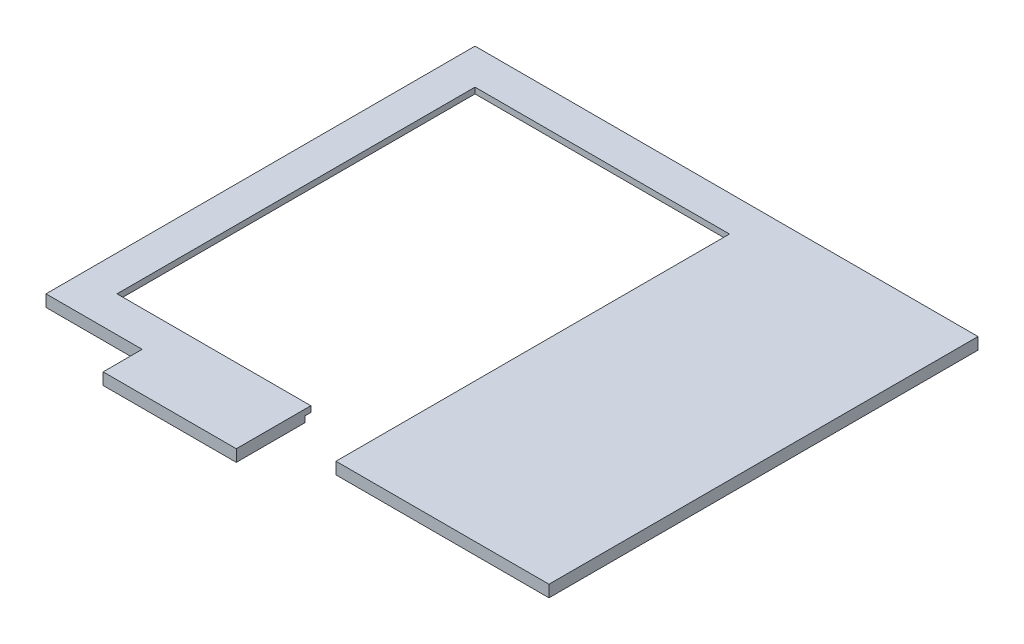
ISO-10303-21;
HEADER;
FILE_DESCRIPTION(('STEP AP214'),'2;1');
FILE_NAME('part.step','',(''),(''),'','','');
FILE_SCHEMA(('AUTOMOTIVE_DESIGN { 1 0 10303 214 1 1 1 1 }'));
ENDSEC;
DATA;
#1=APPLICATION_CONTEXT('core data for automotive mechanical design processes');
#2=APPLICATION_PROTOCOL_DEFINITION('international standard','automotive_design',2000,#1);
#3=PRODUCT_CONTEXT('',#1,'mechanical');
#4=PRODUCT('Part','Part','',(#3));
#5=PRODUCT_RELATED_PRODUCT_CATEGORY('part','',(#4));
#6=PRODUCT_DEFINITION_FORMATION('','',#4);
#7=PRODUCT_DEFINITION_CONTEXT('part definition',#1,'design');
#8=PRODUCT_DEFINITION('design','',#6,#7);
#9=PRODUCT_DEFINITION_SHAPE('','',#8);
#10=(LENGTH_UNIT() NAMED_UNIT(*) SI_UNIT(.MILLI.,.METRE.));
#11=(NAMED_UNIT(*) PLANE_ANGLE_UNIT() SI_UNIT($,.RADIAN.));
#12=(NAMED_UNIT(*) SI_UNIT($,.STERADIAN.) SOLID_ANGLE_UNIT());
#13=UNCERTAINTY_MEASURE_WITH_UNIT(LENGTH_MEASURE(1.E-05),#10,'distance_accuracy_value','');
#14=(GEOMETRIC_REPRESENTATION_CONTEXT(3) GLOBAL_UNCERTAINTY_ASSIGNED_CONTEXT((#13)) GLOBAL_UNIT_ASSIGNED_CONTEXT((#10,
#11,#12)) REPRESENTATION_CONTEXT('',''));
#15=CARTESIAN_POINT('',(0.,0.,0.));
#16=DIRECTION('',(0.,0.,1.));
#17=DIRECTION('',(1.,0.,0.));
#18=AXIS2_PLACEMENT_3D('',#15,#16,#17);
#19=CARTESIAN_POINT('',(0.,59.3432263892751,215.861584775313));
#20=DIRECTION('',(0.,0.,-1.));
#21=DIRECTION('',(-1.,0.,0.));
#22=AXIS2_PLACEMENT_3D('',#19,#20,#21);
#23=PLANE('',#22);
#24=DIRECTION('',(0.,1.,0.));
#25=VECTOR('',#24,1.);
#26=CARTESIAN_POINT('',(-39.181843772894,49.3432263892751,215.861584775313));
#27=LINE('',#26,#25);
#28=CARTESIAN_POINT('',(-39.181843772894,55.3432263892751,215.861584775313));
#29=VERTEX_POINT('',#28);
#30=CARTESIAN_POINT('',(-39.181843772894,59.3432263892751,215.861584775313));
#31=VERTEX_POINT('',#30);
#32=EDGE_CURVE('E185',#29,#31,#27,.T.);
#33=ORIENTED_EDGE('',*,*,#32,.F.);
#34=DIRECTION('',(1.,0.,0.));
#35=VECTOR('',#34,1.);
#36=CARTESIAN_POINT('',(0.,55.3432263892751,215.861584775313));
#37=LINE('',#36,#35);
#38=CARTESIAN_POINT('',(32.818156227106,55.3432263892751,215.861584775313));
#39=VERTEX_POINT('',#38);
#40=EDGE_CURVE('E246',#29,#39,#37,.T.);
#41=ORIENTED_EDGE('',*,*,#40,.T.);
#42=DIRECTION('',(0.,-1.,0.));
#43=VECTOR('',#42,1.);
#44=CARTESIAN_POINT('',(32.818156227106,59.3432263892751,215.861584775313));
#45=LINE('',#44,#43);
#46=CARTESIAN_POINT('',(32.818156227106,59.3432263892751,215.861584775313));
#47=VERTEX_POINT('',#46);
#48=EDGE_CURVE('E195',#47,#39,#45,.T.);
#49=ORIENTED_EDGE('',*,*,#48,.F.);
#50=DIRECTION('',(1.,0.,0.));
#51=VECTOR('',#50,1.);
#52=CARTESIAN_POINT('',(0.,59.3432263892751,215.861584775313));
#53=LINE('',#52,#51);
#54=EDGE_CURVE('E175',#31,#47,#53,.T.);
#55=ORIENTED_EDGE('',*,*,#54,.F.);
#56=EDGE_LOOP('',(#33,#41,#49,#55));
#57=FACE_BOUND('',#56,.T.);
#58=ADVANCED_FACE('F46',(#57),#23,.F.);
#59=CARTESIAN_POINT('',(0.,59.3432263892751,205.861584775313));
#60=DIRECTION('',(0.,0.,1.));
#61=DIRECTION('',(1.,0.,0.));
#62=AXIS2_PLACEMENT_3D('',#59,#60,#61);
#63=PLANE('',#62);
#64=DIRECTION('',(0.,-1.,0.));
#65=VECTOR('',#64,1.);
#66=CARTESIAN_POINT('',(-39.181843772894,59.3432263892751,205.861584775313));
#67=LINE('',#66,#65);
#68=CARTESIAN_POINT('',(-39.181843772894,57.3432263892751,205.861584775313));
#69=VERTEX_POINT('',#68);
#70=CARTESIAN_POINT('',(-39.181843772894,55.3432263892751,205.861584775313));
#71=VERTEX_POINT('',#70);
#72=EDGE_CURVE('E369',#69,#71,#67,.T.);
#73=ORIENTED_EDGE('',*,*,#72,.F.);
#74=DIRECTION('',(1.,0.,0.));
#75=VECTOR('',#74,1.);
#76=CARTESIAN_POINT('',(-37.181843772894,57.3432263892751,205.861584775313));
#77=LINE('',#76,#75);
#78=CARTESIAN_POINT('',(-37.181843772894,57.3432263892751,205.861584775313));
#79=VERTEX_POINT('',#78);
#80=EDGE_CURVE('E356',#69,#79,#77,.T.);
#81=ORIENTED_EDGE('',*,*,#80,.T.);
#82=DIRECTION('',(0.,-1.,0.));
#83=VECTOR('',#82,1.);
#84=CARTESIAN_POINT('',(-37.181843772894,59.3432263892751,205.861584775313));
#85=LINE('',#84,#83);
#86=CARTESIAN_POINT('',(-37.181843772894,55.3432263892751,205.861584775313));
#87=VERTEX_POINT('',#86);
#88=EDGE_CURVE('E294',#79,#87,#85,.T.);
#89=ORIENTED_EDGE('',*,*,#88,.T.);
#90=DIRECTION('',(-1.,0.,0.));
#91=VECTOR('',#90,1.);
#92=CARTESIAN_POINT('',(0.,55.3432263892751,205.861584775313));
#93=LINE('',#92,#91);
#94=EDGE_CURVE('E228',#87,#71,#93,.T.);
#95=ORIENTED_EDGE('',*,*,#94,.T.);
#96=EDGE_LOOP('',(#73,#81,#89,#95));
#97=FACE_BOUND('',#96,.T.);
#98=ADVANCED_FACE('F404',(#97),#63,.F.);
#99=CARTESIAN_POINT('',(-104.681843772894,59.3432263892751,0.));
#100=DIRECTION('',(1.,0.,0.));
#101=DIRECTION('',(0.,0.,-1.));
#102=AXIS2_PLACEMENT_3D('',#99,#100,#101);
#103=PLANE('',#102);
#104=DIRECTION('',(0.,0.,1.));
#105=VECTOR('',#104,1.);
#106=CARTESIAN_POINT('',(-104.681843772894,55.3432263892751,0.));
#107=LINE('',#106,#105);
#108=CARTESIAN_POINT('',(-104.681843772894,55.3432263892751,215.861584775313));
#109=VERTEX_POINT('',#108);
#110=CARTESIAN_POINT('',(-104.681843772894,55.3432263892751,229.045240407346));
#111=VERTEX_POINT('',#110);
#112=EDGE_CURVE('E236',#109,#111,#107,.T.);
#113=ORIENTED_EDGE('',*,*,#112,.T.);
#114=DIRECTION('',(0.,-1.,0.));
#115=VECTOR('',#114,1.);
#116=CARTESIAN_POINT('',(-104.681843772894,59.3432263892751,229.045240407346));
#117=LINE('',#116,#115);
#118=CARTESIAN_POINT('',(-104.681843772894,59.3432263892751,229.045240407346));
#119=VERTEX_POINT('',#118);
#120=EDGE_CURVE('E55',#119,#111,#117,.T.);
#121=ORIENTED_EDGE('',*,*,#120,.F.);
#122=DIRECTION('',(0.,0.,1.));
#123=VECTOR('',#122,1.);
#124=CARTESIAN_POINT('',(-104.681843772894,59.3432263892751,0.));
#125=LINE('',#124,#123);
#126=CARTESIAN_POINT('',(-104.681843772894,59.3432263892751,215.861584775313));
#127=VERTEX_POINT('',#126);
#128=EDGE_CURVE('E261',#127,#119,#125,.T.);
#129=ORIENTED_EDGE('',*,*,#128,.F.);
#130=DIRECTION('',(0.,-1.,0.));
#131=VECTOR('',#130,1.);
#132=CARTESIAN_POINT('',(-104.681843772894,59.3432263892751,215.861584775313));
#133=LINE('',#132,#131);
#134=EDGE_CURVE('E262',#127,#109,#133,.T.);
#135=ORIENTED_EDGE('',*,*,#134,.T.);
#136=EDGE_LOOP('',(#113,#121,#129,#135));
#137=FACE_BOUND('',#136,.T.);
#138=ADVANCED_FACE('F400',(#137),#103,.F.);
#139=CARTESIAN_POINT('',(0.,59.3432263892751,229.045240407346));
#140=DIRECTION('',(0.,0.,-1.));
#141=DIRECTION('',(-1.,0.,0.));
#142=AXIS2_PLACEMENT_3D('',#139,#140,#141);
#143=PLANE('',#142);
#144=DIRECTION('',(1.,0.,0.));
#145=VECTOR('',#144,1.);
#146=CARTESIAN_POINT('',(0.,55.3432263892751,229.045240407346));
#147=LINE('',#146,#145);
#148=CARTESIAN_POINT('',(-59.681843772894,55.3432263892751,229.045240407346));
#149=VERTEX_POINT('',#148);
#150=EDGE_CURVE('E240',#111,#149,#147,.T.);
#151=ORIENTED_EDGE('',*,*,#150,.T.);
#152=DIRECTION('',(0.,-1.,0.));
#153=VECTOR('',#152,1.);
#154=CARTESIAN_POINT('',(-59.681843772894,59.3432263892751,229.045240407346));
#155=LINE('',#154,#153);
#156=CARTESIAN_POINT('',(-59.681843772894,59.3432263892751,229.045240407346));
#157=VERTEX_POINT('',#156);
#158=EDGE_CURVE('E281',#157,#149,#155,.T.);
#159=ORIENTED_EDGE('',*,*,#158,.F.);
#160=DIRECTION('',(1.,0.,0.));
#161=VECTOR('',#160,1.);
#162=CARTESIAN_POINT('',(0.,59.3432263892751,229.045240407346));
#163=LINE('',#162,#161);
#164=EDGE_CURVE('E205',#119,#157,#163,.T.);
#165=ORIENTED_EDGE('',*,*,#164,.F.);
#166=ORIENTED_EDGE('',*,*,#120,.T.);
#167=EDGE_LOOP('',(#151,#159,#165,#166));
#168=FACE_BOUND('',#167,.T.);
#169=ADVANCED_FACE('F386',(#168),#143,.F.);
#170=CARTESIAN_POINT('',(-59.681843772894,59.3432263892751,0.));
#171=DIRECTION('',(-1.,0.,0.));
#172=DIRECTION('',(0.,0.,1.));
#173=AXIS2_PLACEMENT_3D('',#170,#171,#172);
#174=PLANE('',#173);
#175=DIRECTION('',(0.,0.,-1.));
#176=VECTOR('',#175,1.);
#177=CARTESIAN_POINT('',(-59.681843772894,55.3432263892751,0.));
#178=LINE('',#177,#176);
#179=CARTESIAN_POINT('',(-59.681843772894,55.3432263892751,205.861584775313));
#180=VERTEX_POINT('',#179);
#181=EDGE_CURVE('E243',#149,#180,#178,.T.);
#182=ORIENTED_EDGE('',*,*,#181,.T.);
#183=DIRECTION('',(0.,-1.,0.));
#184=VECTOR('',#183,1.);
#185=CARTESIAN_POINT('',(-59.681843772894,59.3432263892751,205.861584775313));
#186=LINE('',#185,#184);
#187=CARTESIAN_POINT('',(-59.681843772894,57.3432263892751,205.861584775313));
#188=VERTEX_POINT('',#187);
#189=EDGE_CURVE('E61',#188,#180,#186,.T.);
#190=ORIENTED_EDGE('',*,*,#189,.F.);
#191=DIRECTION('',(0.,0.,-1.));
#192=VECTOR('',#191,1.);
#193=CARTESIAN_POINT('',(-59.681843772894,57.3432263892751,205.861584775313));
#194=LINE('',#193,#192);
#195=CARTESIAN_POINT('',(-59.681843772894,57.3432263892751,203.861584775313));
#196=VERTEX_POINT('',#195);
#197=EDGE_CURVE('E11',#188,#196,#194,.T.);
#198=ORIENTED_EDGE('',*,*,#197,.T.);
#199=DIRECTION('',(0.,1.,0.));
#200=VECTOR('',#199,1.);
#201=CARTESIAN_POINT('',(-59.681843772894,49.3432263892751,203.861584775313));
#202=LINE('',#201,#200);
#203=CARTESIAN_POINT('',(-59.681843772894,59.3432263892751,203.861584775313));
#204=VERTEX_POINT('',#203);
#205=EDGE_CURVE('E192',#196,#204,#202,.T.);
#206=ORIENTED_EDGE('',*,*,#205,.T.);
#207=DIRECTION('',(0.,0.,-1.));
#208=VECTOR('',#207,1.);
#209=CARTESIAN_POINT('',(-59.681843772894,59.3432263892751,0.));
#210=LINE('',#209,#208);
#211=EDGE_CURVE('E199',#157,#204,#210,.T.);
#212=ORIENTED_EDGE('',*,*,#211,.F.);
#213=ORIENTED_EDGE('',*,*,#158,.T.);
#214=EDGE_LOOP('',(#182,#190,#198,#206,#212,#213));
#215=FACE_BOUND('',#214,.T.);
#216=ADVANCED_FACE('F387',(#215),#174,.F.);
#217=CARTESIAN_POINT('',(32.818156227106,59.3432263892751,0.));
#218=DIRECTION('',(-1.,0.,0.));
#219=DIRECTION('',(0.,0.,1.));
#220=AXIS2_PLACEMENT_3D('',#217,#218,#219);
#221=PLANE('',#220);
#222=DIRECTION('',(0.,0.,-1.));
#223=VECTOR('',#222,1.);
#224=CARTESIAN_POINT('',(32.818156227106,55.3432263892751,0.));
#225=LINE('',#224,#223);
#226=CARTESIAN_POINT('',(32.818156227106,55.3432263892751,70.8615847753127));
#227=VERTEX_POINT('',#226);
#228=EDGE_CURVE('E249',#39,#227,#225,.T.);
#229=ORIENTED_EDGE('',*,*,#228,.T.);
#230=DIRECTION('',(0.,-1.,0.));
#231=VECTOR('',#230,1.);
#232=CARTESIAN_POINT('',(32.818156227106,59.3432263892751,70.8615847753127));
#233=LINE('',#232,#231);
#234=CARTESIAN_POINT('',(32.818156227106,59.3432263892751,70.8615847753127));
#235=VERTEX_POINT('',#234);
#236=EDGE_CURVE('E275',#235,#227,#233,.T.);
#237=ORIENTED_EDGE('',*,*,#236,.F.);
#238=DIRECTION('',(0.,0.,-1.));
#239=VECTOR('',#238,1.);
#240=CARTESIAN_POINT('',(32.818156227106,59.3432263892751,0.));
#241=LINE('',#240,#239);
#242=EDGE_CURVE('E198',#47,#235,#241,.T.);
#243=ORIENTED_EDGE('',*,*,#242,.F.);
#244=ORIENTED_EDGE('',*,*,#48,.T.);
#245=EDGE_LOOP('',(#229,#237,#243,#244));
#246=FACE_BOUND('',#245,.T.);
#247=ADVANCED_FACE('F389',(#246),#221,.F.);
#248=CARTESIAN_POINT('',(0.,59.3432263892751,70.8615847753127));
#249=DIRECTION('',(0.,0.,1.));
#250=DIRECTION('',(1.,0.,0.));
#251=AXIS2_PLACEMENT_3D('',#248,#249,#250);
#252=PLANE('',#251);
#253=DIRECTION('',(-1.,0.,0.));
#254=VECTOR('',#253,1.);
#255=CARTESIAN_POINT('',(0.,55.3432263892751,70.8615847753127));
#256=LINE('',#255,#254);
#257=CARTESIAN_POINT('',(-137.181843772894,55.3432263892751,70.8615847753127));
#258=VERTEX_POINT('',#257);
#259=EDGE_CURVE('E252',#227,#258,#256,.T.);
#260=ORIENTED_EDGE('',*,*,#259,.T.);
#261=DIRECTION('',(0.,-1.,0.));
#262=VECTOR('',#261,1.);
#263=CARTESIAN_POINT('',(-137.181843772894,59.3432263892751,70.8615847753127));
#264=LINE('',#263,#262);
#265=CARTESIAN_POINT('',(-137.181843772894,59.3432263892751,70.8615847753127));
#266=VERTEX_POINT('',#265);
#267=EDGE_CURVE('E271',#266,#258,#264,.T.);
#268=ORIENTED_EDGE('',*,*,#267,.F.);
#269=DIRECTION('',(-1.,0.,0.));
#270=VECTOR('',#269,1.);
#271=CARTESIAN_POINT('',(0.,59.3432263892751,70.8615847753127));
#272=LINE('',#271,#270);
#273=EDGE_CURVE('E203',#235,#266,#272,.T.);
#274=ORIENTED_EDGE('',*,*,#273,.F.);
#275=ORIENTED_EDGE('',*,*,#236,.T.);
#276=EDGE_LOOP('',(#260,#268,#274,#275));
#277=FACE_BOUND('',#276,.T.);
#278=ADVANCED_FACE('F396',(#277),#252,.F.);
#279=CARTESIAN_POINT('',(-137.181843772894,59.3432263892751,0.));
#280=DIRECTION('',(1.,0.,0.));
#281=DIRECTION('',(0.,0.,-1.));
#282=AXIS2_PLACEMENT_3D('',#279,#280,#281);
#283=PLANE('',#282);
#284=DIRECTION('',(0.,0.,1.));
#285=VECTOR('',#284,1.);
#286=CARTESIAN_POINT('',(-137.181843772894,55.3432263892751,0.));
#287=LINE('',#286,#285);
#288=CARTESIAN_POINT('',(-137.181843772894,55.3432263892751,215.861584775313));
#289=VERTEX_POINT('',#288);
#290=EDGE_CURVE('E255',#258,#289,#287,.T.);
#291=ORIENTED_EDGE('',*,*,#290,.T.);
#292=DIRECTION('',(0.,-1.,0.));
#293=VECTOR('',#292,1.);
#294=CARTESIAN_POINT('',(-137.181843772894,59.3432263892751,215.861584775313));
#295=LINE('',#294,#293);
#296=CARTESIAN_POINT('',(-137.181843772894,59.3432263892751,215.861584775313));
#297=VERTEX_POINT('',#296);
#298=EDGE_CURVE('E266',#297,#289,#295,.T.);
#299=ORIENTED_EDGE('',*,*,#298,.F.);
#300=DIRECTION('',(0.,0.,1.));
#301=VECTOR('',#300,1.);
#302=CARTESIAN_POINT('',(-137.181843772894,59.3432263892751,0.));
#303=LINE('',#302,#301);
#304=EDGE_CURVE('E211',#266,#297,#303,.T.);
#305=ORIENTED_EDGE('',*,*,#304,.F.);
#306=ORIENTED_EDGE('',*,*,#267,.T.);
#307=EDGE_LOOP('',(#291,#299,#305,#306));
#308=FACE_BOUND('',#307,.T.);
#309=ADVANCED_FACE('F415',(#308),#283,.F.);
#310=CARTESIAN_POINT('',(0.,59.3432263892751,80.8615847753127));
#311=DIRECTION('',(0.,0.,-1.));
#312=DIRECTION('',(-1.,0.,0.));
#313=AXIS2_PLACEMENT_3D('',#310,#311,#312);
#314=PLANE('',#313);
#315=DIRECTION('',(0.,-1.,0.));
#316=VECTOR('',#315,1.);
#317=CARTESIAN_POINT('',(-37.181843772894,59.3432263892751,80.8615847753127));
#318=LINE('',#317,#316);
#319=CARTESIAN_POINT('',(-37.181843772894,57.3432263892751,80.8615847753127));
#320=VERTEX_POINT('',#319);
#321=CARTESIAN_POINT('',(-37.181843772894,55.3432263892751,80.8615847753127));
#322=VERTEX_POINT('',#321);
#323=EDGE_CURVE('E267',#320,#322,#318,.T.);
#324=ORIENTED_EDGE('',*,*,#323,.F.);
#325=DIRECTION('',(-1.,0.,0.));
#326=VECTOR('',#325,1.);
#327=CARTESIAN_POINT('',(-127.181843772894,57.3432263892751,80.8615847753127));
#328=LINE('',#327,#326);
#329=CARTESIAN_POINT('',(-127.181843772894,57.3432263892751,80.8615847753127));
#330=VERTEX_POINT('',#329);
#331=EDGE_CURVE('E314',#320,#330,#328,.T.);
#332=ORIENTED_EDGE('',*,*,#331,.T.);
#333=DIRECTION('',(0.,-1.,0.));
#334=VECTOR('',#333,1.);
#335=CARTESIAN_POINT('',(-127.181843772894,59.3432263892751,80.8615847753127));
#336=LINE('',#335,#334);
#337=CARTESIAN_POINT('',(-127.181843772894,55.3432263892751,80.8615847753127));
#338=VERTEX_POINT('',#337);
#339=EDGE_CURVE('E217',#330,#338,#336,.T.);
#340=ORIENTED_EDGE('',*,*,#339,.T.);
#341=DIRECTION('',(1.,0.,0.));
#342=VECTOR('',#341,1.);
#343=CARTESIAN_POINT('',(0.,55.3432263892751,80.8615847753127));
#344=LINE('',#343,#342);
#345=EDGE_CURVE('E218',#338,#322,#344,.T.);
#346=ORIENTED_EDGE('',*,*,#345,.T.);
#347=EDGE_LOOP('',(#324,#332,#340,#346));
#348=FACE_BOUND('',#347,.T.);
#349=ADVANCED_FACE('F48',(#348),#314,.F.);
#350=CARTESIAN_POINT('',(-37.181843772894,59.3432263892751,0.));
#351=DIRECTION('',(1.,0.,0.));
#352=DIRECTION('',(0.,0.,-1.));
#353=AXIS2_PLACEMENT_3D('',#350,#351,#352);
#354=PLANE('',#353);
#355=ORIENTED_EDGE('',*,*,#88,.F.);
#356=DIRECTION('',(0.,0.,-1.));
#357=VECTOR('',#356,1.);
#358=CARTESIAN_POINT('',(-37.181843772894,57.3432263892751,80.8615847753127));
#359=LINE('',#358,#357);
#360=EDGE_CURVE('E305',#79,#320,#359,.T.);
#361=ORIENTED_EDGE('',*,*,#360,.T.);
#362=ORIENTED_EDGE('',*,*,#323,.T.);
#363=DIRECTION('',(0.,0.,1.));
#364=VECTOR('',#363,1.);
#365=CARTESIAN_POINT('',(-37.181843772894,55.3432263892751,0.));
#366=LINE('',#365,#364);
#367=EDGE_CURVE('E222',#322,#87,#366,.T.);
#368=ORIENTED_EDGE('',*,*,#367,.T.);
#369=EDGE_LOOP('',(#355,#361,#362,#368));
#370=FACE_BOUND('',#369,.T.);
#371=ADVANCED_FACE('F302',(#370),#354,.F.);
#372=CARTESIAN_POINT('',(-127.181843772894,57.3432263892751,205.861584775313));
#373=VERTEX_POINT('',#372);
#374=EDGE_CURVE('E68',#373,#188,#77,.T.);
#375=ORIENTED_EDGE('',*,*,#374,.T.);
#376=ORIENTED_EDGE('',*,*,#189,.T.);
#377=CARTESIAN_POINT('',(-127.181843772894,55.3432263892751,205.861584775313));
#378=VERTEX_POINT('',#377);
#379=EDGE_CURVE('E227',#180,#378,#93,.T.);
#380=ORIENTED_EDGE('',*,*,#379,.T.);
#381=DIRECTION('',(0.,-1.,0.));
#382=VECTOR('',#381,1.);
#383=CARTESIAN_POINT('',(-127.181843772894,59.3432263892751,205.861584775313));
#384=LINE('',#383,#382);
#385=EDGE_CURVE('E290',#373,#378,#384,.T.);
#386=ORIENTED_EDGE('',*,*,#385,.F.);
#387=EDGE_LOOP('',(#375,#376,#380,#386));
#388=FACE_BOUND('',#387,.T.);
#389=ADVANCED_FACE('F411',(#388),#63,.F.);
#390=CARTESIAN_POINT('',(-127.181843772894,59.3432263892751,0.));
#391=DIRECTION('',(-1.,0.,0.));
#392=DIRECTION('',(0.,0.,1.));
#393=AXIS2_PLACEMENT_3D('',#390,#391,#392);
#394=PLANE('',#393);
#395=ORIENTED_EDGE('',*,*,#339,.F.);
#396=DIRECTION('',(0.,0.,1.));
#397=VECTOR('',#396,1.);
#398=CARTESIAN_POINT('',(-127.181843772894,57.3432263892751,205.861584775313));
#399=LINE('',#398,#397);
#400=EDGE_CURVE('E362',#330,#373,#399,.T.);
#401=ORIENTED_EDGE('',*,*,#400,.T.);
#402=ORIENTED_EDGE('',*,*,#385,.T.);
#403=DIRECTION('',(0.,0.,-1.));
#404=VECTOR('',#403,1.);
#405=CARTESIAN_POINT('',(-127.181843772894,55.3432263892751,0.));
#406=LINE('',#405,#404);
#407=EDGE_CURVE('E232',#378,#338,#406,.T.);
#408=ORIENTED_EDGE('',*,*,#407,.T.);
#409=EDGE_LOOP('',(#395,#401,#402,#408));
#410=FACE_BOUND('',#409,.T.);
#411=ADVANCED_FACE('F316',(#410),#394,.F.);
#412=CARTESIAN_POINT('',(0.,59.3432263892751,215.861584775313));
#413=DIRECTION('',(0.,0.,-1.));
#414=DIRECTION('',(-1.,0.,0.));
#415=AXIS2_PLACEMENT_3D('',#412,#413,#414);
#416=PLANE('',#415);
#417=DIRECTION('',(1.,0.,0.));
#418=VECTOR('',#417,1.);
#419=CARTESIAN_POINT('',(0.,55.3432263892751,215.861584775313));
#420=LINE('',#419,#418);
#421=EDGE_CURVE('E258',#289,#109,#420,.T.);
#422=ORIENTED_EDGE('',*,*,#421,.T.);
#423=ORIENTED_EDGE('',*,*,#134,.F.);
#424=DIRECTION('',(1.,0.,0.));
#425=VECTOR('',#424,1.);
#426=CARTESIAN_POINT('',(0.,59.3432263892751,215.861584775313));
#427=LINE('',#426,#425);
#428=EDGE_CURVE('E214',#297,#127,#427,.T.);
#429=ORIENTED_EDGE('',*,*,#428,.F.);
#430=ORIENTED_EDGE('',*,*,#298,.T.);
#431=EDGE_LOOP('',(#422,#423,#429,#430));
#432=FACE_BOUND('',#431,.T.);
#433=ADVANCED_FACE('F420',(#432),#416,.F.);
#434=CARTESIAN_POINT('',(0.,59.3432263892751,0.));
#435=DIRECTION('',(0.,1.,0.));
#436=DIRECTION('',(0.,0.,1.));
#437=AXIS2_PLACEMENT_3D('',#434,#435,#436);
#438=PLANE('',#437);
#439=ORIENTED_EDGE('',*,*,#211,.T.);
#440=DIRECTION('',(1.,0.,0.));
#441=VECTOR('',#440,1.);
#442=CARTESIAN_POINT('',(-39.181843772894,59.3432263892751,203.861584775313));
#443=LINE('',#442,#441);
#444=CARTESIAN_POINT('',(-125.181843772894,59.3432263892751,203.861584775313));
#445=VERTEX_POINT('',#444);
#446=EDGE_CURVE('E347',#445,#204,#443,.T.);
#447=ORIENTED_EDGE('',*,*,#446,.F.);
#448=DIRECTION('',(0.,0.,1.));
#449=VECTOR('',#448,1.);
#450=CARTESIAN_POINT('',(-125.181843772894,59.3432263892751,203.861584775313));
#451=LINE('',#450,#449);
#452=CARTESIAN_POINT('',(-125.181843772894,59.3432263892751,82.8615847753127));
#453=VERTEX_POINT('',#452);
#454=EDGE_CURVE('E340',#453,#445,#451,.T.);
#455=ORIENTED_EDGE('',*,*,#454,.F.);
#456=DIRECTION('',(-1.,0.,0.));
#457=VECTOR('',#456,1.);
#458=CARTESIAN_POINT('',(-125.181843772894,59.3432263892751,82.8615847753127));
#459=LINE('',#458,#457);
#460=CARTESIAN_POINT('',(-39.181843772894,59.3432263892751,82.8615847753127));
#461=VERTEX_POINT('',#460);
#462=EDGE_CURVE('E179',#461,#453,#459,.T.);
#463=ORIENTED_EDGE('',*,*,#462,.F.);
#464=DIRECTION('',(0.,0.,-1.));
#465=VECTOR('',#464,1.);
#466=CARTESIAN_POINT('',(-39.181843772894,59.3432263892751,82.8615847753127));
#467=LINE('',#466,#465);
#468=EDGE_CURVE('E171',#31,#461,#467,.T.);
#469=ORIENTED_EDGE('',*,*,#468,.F.);
#470=ORIENTED_EDGE('',*,*,#54,.T.);
#471=ORIENTED_EDGE('',*,*,#242,.T.);
#472=ORIENTED_EDGE('',*,*,#273,.T.);
#473=ORIENTED_EDGE('',*,*,#304,.T.);
#474=ORIENTED_EDGE('',*,*,#428,.T.);
#475=ORIENTED_EDGE('',*,*,#128,.T.);
#476=ORIENTED_EDGE('',*,*,#164,.T.);
#477=EDGE_LOOP('',(#439,#447,#455,#463,#469,#470,#471,#472,#473,#474,#475,#476));
#478=FACE_BOUND('',#477,.T.);
#479=ADVANCED_FACE('F173',(#478),#438,.T.);
#480=CARTESIAN_POINT('',(0.,55.3432263892751,0.));
#481=DIRECTION('',(0.,1.,0.));
#482=DIRECTION('',(0.,0.,1.));
#483=AXIS2_PLACEMENT_3D('',#480,#481,#482);
#484=PLANE('',#483);
#485=ORIENTED_EDGE('',*,*,#379,.F.);
#486=ORIENTED_EDGE('',*,*,#181,.F.);
#487=ORIENTED_EDGE('',*,*,#150,.F.);
#488=ORIENTED_EDGE('',*,*,#112,.F.);
#489=ORIENTED_EDGE('',*,*,#421,.F.);
#490=ORIENTED_EDGE('',*,*,#290,.F.);
#491=ORIENTED_EDGE('',*,*,#259,.F.);
#492=ORIENTED_EDGE('',*,*,#228,.F.);
#493=ORIENTED_EDGE('',*,*,#40,.F.);
#494=DIRECTION('',(0.,0.,1.));
#495=VECTOR('',#494,1.);
#496=CARTESIAN_POINT('',(-39.181843772894,55.3432263892751,0.));
#497=LINE('',#496,#495);
#498=EDGE_CURVE('E188',#71,#29,#497,.T.);
#499=ORIENTED_EDGE('',*,*,#498,.F.);
#500=ORIENTED_EDGE('',*,*,#94,.F.);
#501=ORIENTED_EDGE('',*,*,#367,.F.);
#502=ORIENTED_EDGE('',*,*,#345,.F.);
#503=ORIENTED_EDGE('',*,*,#407,.F.);
#504=EDGE_LOOP('',(#485,#486,#487,#488,#489,#490,#491,#492,#493,#499,#500,#501,#502,#503));
#505=FACE_BOUND('',#504,.T.);
#506=ADVANCED_FACE('F311',(#505),#484,.F.);
#507=CARTESIAN_POINT('',(-39.181843772894,-96.6859916182185,203.861584775313));
#508=DIRECTION('',(0.,0.,1.));
#509=DIRECTION('',(1.,0.,0.));
#510=AXIS2_PLACEMENT_3D('',#507,#508,#509);
#511=PLANE('',#510);
#512=ORIENTED_EDGE('',*,*,#446,.T.);
#513=ORIENTED_EDGE('',*,*,#205,.F.);
#514=DIRECTION('',(1.,0.,0.));
#515=VECTOR('',#514,1.);
#516=CARTESIAN_POINT('',(-39.181843772894,57.3432263892751,203.861584775313));
#517=LINE('',#516,#515);
#518=CARTESIAN_POINT('',(-125.181843772894,57.3432263892751,203.861584775313));
#519=VERTEX_POINT('',#518);
#520=EDGE_CURVE('E328',#519,#196,#517,.T.);
#521=ORIENTED_EDGE('',*,*,#520,.F.);
#522=DIRECTION('',(0.,1.,0.));
#523=VECTOR('',#522,1.);
#524=CARTESIAN_POINT('',(-125.181843772894,-96.6859916182185,203.861584775313));
#525=LINE('',#524,#523);
#526=EDGE_CURVE('E351',#519,#445,#525,.T.);
#527=ORIENTED_EDGE('',*,*,#526,.T.);
#528=EDGE_LOOP('',(#512,#513,#521,#527));
#529=FACE_BOUND('',#528,.T.);
#530=ADVANCED_FACE('F426',(#529),#511,.F.);
#531=CARTESIAN_POINT('',(-125.181843772894,-96.6859916182185,203.861584775313));
#532=DIRECTION('',(-1.,0.,0.));
#533=DIRECTION('',(0.,0.,1.));
#534=AXIS2_PLACEMENT_3D('',#531,#532,#533);
#535=PLANE('',#534);
#536=DIRECTION('',(0.,0.,1.));
#537=VECTOR('',#536,1.);
#538=CARTESIAN_POINT('',(-125.181843772894,57.3432263892751,203.861584775313));
#539=LINE('',#538,#537);
#540=CARTESIAN_POINT('',(-125.181843772894,57.3432263892751,82.8615847753127));
#541=VERTEX_POINT('',#540);
#542=EDGE_CURVE('E182',#541,#519,#539,.T.);
#543=ORIENTED_EDGE('',*,*,#542,.F.);
#544=DIRECTION('',(0.,1.,0.));
#545=VECTOR('',#544,1.);
#546=CARTESIAN_POINT('',(-125.181843772894,-96.6859916182185,82.8615847753127));
#547=LINE('',#546,#545);
#548=EDGE_CURVE('E344',#541,#453,#547,.T.);
#549=ORIENTED_EDGE('',*,*,#548,.T.);
#550=ORIENTED_EDGE('',*,*,#454,.T.);
#551=ORIENTED_EDGE('',*,*,#526,.F.);
#552=EDGE_LOOP('',(#543,#549,#550,#551));
#553=FACE_BOUND('',#552,.T.);
#554=ADVANCED_FACE('F434',(#553),#535,.F.);
#555=CARTESIAN_POINT('',(-125.181843772894,-96.6859916182185,82.8615847753127));
#556=DIRECTION('',(0.,0.,-1.));
#557=DIRECTION('',(-1.,0.,0.));
#558=AXIS2_PLACEMENT_3D('',#555,#556,#557);
#559=PLANE('',#558);
#560=DIRECTION('',(-1.,0.,0.));
#561=VECTOR('',#560,1.);
#562=CARTESIAN_POINT('',(-125.181843772894,57.3432263892751,82.8615847753127));
#563=LINE('',#562,#561);
#564=CARTESIAN_POINT('',(-39.181843772894,57.3432263892751,82.8615847753127));
#565=VERTEX_POINT('',#564);
#566=EDGE_CURVE('E223',#565,#541,#563,.T.);
#567=ORIENTED_EDGE('',*,*,#566,.F.);
#568=DIRECTION('',(0.,1.,0.));
#569=VECTOR('',#568,1.);
#570=CARTESIAN_POINT('',(-39.181843772894,-96.6859916182185,82.8615847753127));
#571=LINE('',#570,#569);
#572=EDGE_CURVE('E337',#565,#461,#571,.T.);
#573=ORIENTED_EDGE('',*,*,#572,.T.);
#574=ORIENTED_EDGE('',*,*,#462,.T.);
#575=ORIENTED_EDGE('',*,*,#548,.F.);
#576=EDGE_LOOP('',(#567,#573,#574,#575));
#577=FACE_BOUND('',#576,.T.);
#578=ADVANCED_FACE('F438',(#577),#559,.F.);
#579=CARTESIAN_POINT('',(-39.181843772894,-96.6859916182185,82.8615847753127));
#580=DIRECTION('',(1.,0.,0.));
#581=DIRECTION('',(0.,0.,-1.));
#582=AXIS2_PLACEMENT_3D('',#579,#580,#581);
#583=PLANE('',#582);
#584=DIRECTION('',(0.,0.,-1.));
#585=VECTOR('',#584,1.);
#586=CARTESIAN_POINT('',(-39.181843772894,57.3432263892751,82.8615847753127));
#587=LINE('',#586,#585);
#588=EDGE_CURVE('E324',#69,#565,#587,.T.);
#589=ORIENTED_EDGE('',*,*,#588,.F.);
#590=ORIENTED_EDGE('',*,*,#72,.T.);
#591=ORIENTED_EDGE('',*,*,#498,.T.);
#592=ORIENTED_EDGE('',*,*,#32,.T.);
#593=ORIENTED_EDGE('',*,*,#468,.T.);
#594=ORIENTED_EDGE('',*,*,#572,.F.);
#595=EDGE_LOOP('',(#589,#590,#591,#592,#593,#594));
#596=FACE_BOUND('',#595,.T.);
#597=ADVANCED_FACE('F186',(#596),#583,.F.);
#598=CARTESIAN_POINT('',(-127.181843772894,57.3432263892751,205.861584775313));
#599=DIRECTION('',(0.,-1.,0.));
#600=DIRECTION('',(0.,0.,-1.));
#601=AXIS2_PLACEMENT_3D('',#598,#599,#600);
#602=PLANE('',#601);
#603=ORIENTED_EDGE('',*,*,#197,.F.);
#604=ORIENTED_EDGE('',*,*,#374,.F.);
#605=ORIENTED_EDGE('',*,*,#400,.F.);
#606=ORIENTED_EDGE('',*,*,#331,.F.);
#607=ORIENTED_EDGE('',*,*,#360,.F.);
#608=ORIENTED_EDGE('',*,*,#80,.F.);
#609=ORIENTED_EDGE('',*,*,#588,.T.);
#610=ORIENTED_EDGE('',*,*,#566,.T.);
#611=ORIENTED_EDGE('',*,*,#542,.T.);
#612=ORIENTED_EDGE('',*,*,#520,.T.);
#613=EDGE_LOOP('',(#603,#604,#605,#606,#607,#608,#609,#610,#611,#612));
#614=FACE_BOUND('',#613,.T.);
#615=ADVANCED_FACE('F429',(#614),#602,.T.);
#616=CLOSED_SHELL('',(#58,#98,#138,#169,#216,#247,#278,#309,#349,#371,#389,#411,#433,#479,#506,
#530,#554,#578,#597,#615));
#617=MANIFOLD_SOLID_BREP('B2',#616);
#618=ADVANCED_BREP_SHAPE_REPRESENTATION('',(#18,#617),#14);
#619=SHAPE_DEFINITION_REPRESENTATION(#9,#618);
ENDSEC;
END-ISO-10303-21;
